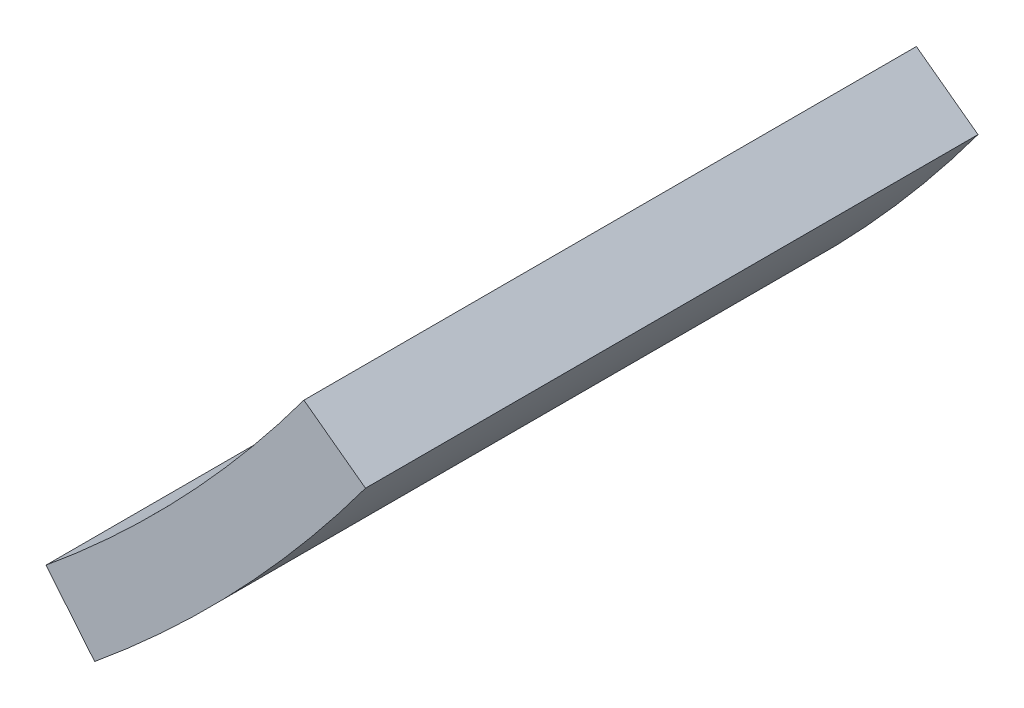
ISO-10303-21;
HEADER;
FILE_DESCRIPTION(('STEP AP214'),'2;1');
FILE_NAME('part.step','',(''),(''),'','','');
FILE_SCHEMA(('AUTOMOTIVE_DESIGN { 1 0 10303 214 1 1 1 1 }'));
ENDSEC;
DATA;
#1=APPLICATION_CONTEXT('core data for automotive mechanical design processes');
#2=APPLICATION_PROTOCOL_DEFINITION('international standard','automotive_design',2000,#1);
#3=PRODUCT_CONTEXT('',#1,'mechanical');
#4=PRODUCT('Part','Part','',(#3));
#5=PRODUCT_RELATED_PRODUCT_CATEGORY('part','',(#4));
#6=PRODUCT_DEFINITION_FORMATION('','',#4);
#7=PRODUCT_DEFINITION_CONTEXT('part definition',#1,'design');
#8=PRODUCT_DEFINITION('design','',#6,#7);
#9=PRODUCT_DEFINITION_SHAPE('','',#8);
#10=(LENGTH_UNIT() NAMED_UNIT(*) SI_UNIT(.MILLI.,.METRE.));
#11=(NAMED_UNIT(*) PLANE_ANGLE_UNIT() SI_UNIT($,.RADIAN.));
#12=(NAMED_UNIT(*) SI_UNIT($,.STERADIAN.) SOLID_ANGLE_UNIT());
#13=UNCERTAINTY_MEASURE_WITH_UNIT(LENGTH_MEASURE(1.E-05),#10,'distance_accuracy_value','');
#14=(GEOMETRIC_REPRESENTATION_CONTEXT(3) GLOBAL_UNCERTAINTY_ASSIGNED_CONTEXT((#13)) GLOBAL_UNIT_ASSIGNED_CONTEXT((#10,
#11,#12)) REPRESENTATION_CONTEXT('',''));
#15=CARTESIAN_POINT('',(0.,0.,0.));
#16=DIRECTION('',(0.,0.,1.));
#17=DIRECTION('',(1.,0.,0.));
#18=AXIS2_PLACEMENT_3D('',#15,#16,#17);
#19=CARTESIAN_POINT('',(-47.8023196423174,-23.0706537632891,10.));
#20=DIRECTION('',(0.772058239718347,0.63555178741233,0.));
#21=DIRECTION('',(0.,0.,-1.));
#22=AXIS2_PLACEMENT_3D('',#19,#20,#21);
#23=PLANE('',#22);
#24=DIRECTION('',(0.635551787412331,-0.772058239718347,0.));
#25=VECTOR('',#24,1.);
#26=CARTESIAN_POINT('',(-47.8023196423174,-23.0706537632891,-18.));
#27=LINE('',#26,#25);
#28=CARTESIAN_POINT('',(-18.0117501788919,-59.2597654543832,-18.));
#29=VERTEX_POINT('',#28);
#30=CARTESIAN_POINT('',(-15.3106550824186,-62.541012973151,-18.));
#31=VERTEX_POINT('',#30);
#32=EDGE_CURVE('E11',#29,#31,#27,.T.);
#33=ORIENTED_EDGE('',*,*,#32,.T.);
#34=DIRECTION('',(0.,0.,-1.));
#35=VECTOR('',#34,1.);
#36=CARTESIAN_POINT('',(-15.3106550824186,-62.541012973151,10.));
#37=LINE('',#36,#35);
#38=CARTESIAN_POINT('',(-15.3106550824186,-62.541012973151,16.));
#39=VERTEX_POINT('',#38);
#40=EDGE_CURVE('E37',#39,#31,#37,.T.);
#41=ORIENTED_EDGE('',*,*,#40,.F.);
#42=DIRECTION('',(0.635551787412331,-0.772058239718347,0.));
#43=VECTOR('',#42,1.);
#44=CARTESIAN_POINT('',(-47.8023196423174,-23.0706537632891,16.));
#45=LINE('',#44,#43);
#46=CARTESIAN_POINT('',(-18.0117501788919,-59.2597654543832,16.));
#47=VERTEX_POINT('',#46);
#48=EDGE_CURVE('E21',#47,#39,#45,.T.);
#49=ORIENTED_EDGE('',*,*,#48,.F.);
#50=DIRECTION('',(0.,0.,-1.));
#51=VECTOR('',#50,1.);
#52=CARTESIAN_POINT('',(-18.0117501788919,-59.2597654543832,10.));
#53=LINE('',#52,#51);
#54=EDGE_CURVE('E28',#47,#29,#53,.T.);
#55=ORIENTED_EDGE('',*,*,#54,.T.);
#56=EDGE_LOOP('',(#33,#41,#49,#55));
#57=FACE_BOUND('',#56,.T.);
#58=ADVANCED_FACE('F17',(#57),#23,.F.);
#59=CARTESIAN_POINT('',(-71.8747641621128,6.17217036174182,10.));
#60=DIRECTION('',(0.,0.,-1.));
#61=DIRECTION('',(-1.,0.,0.));
#62=AXIS2_PLACEMENT_3D('',#59,#60,#61);
#63=CYLINDRICAL_SURFACE('',#62,88.999999999967);
#64=CARTESIAN_POINT('',(-71.8747641621128,6.17217036174182,-18.));
#65=DIRECTION('',(0.,0.,1.));
#66=DIRECTION('',(-1.,0.,0.));
#67=AXIS2_PLACEMENT_3D('',#64,#65,#66);
#68=CIRCLE('',#67,88.999999999967);
#69=CARTESIAN_POINT('',(-0.277555078629754,-46.6940726620456,-18.));
#70=VERTEX_POINT('',#69);
#71=EDGE_CURVE('E89',#31,#70,#68,.T.);
#72=ORIENTED_EDGE('',*,*,#71,.T.);
#73=DIRECTION('',(0.,0.,-1.));
#74=VECTOR('',#73,1.);
#75=CARTESIAN_POINT('',(-0.277555078629754,-46.6940726620456,10.));
#76=LINE('',#75,#74);
#77=CARTESIAN_POINT('',(-0.277555078629754,-46.6940726620456,16.));
#78=VERTEX_POINT('',#77);
#79=EDGE_CURVE('E76',#78,#70,#76,.T.);
#80=ORIENTED_EDGE('',*,*,#79,.F.);
#81=CARTESIAN_POINT('',(-71.8747641621128,6.17217036174182,16.));
#82=DIRECTION('',(0.,0.,1.));
#83=DIRECTION('',(-1.,0.,0.));
#84=AXIS2_PLACEMENT_3D('',#81,#82,#83);
#85=CIRCLE('',#84,88.999999999967);
#86=EDGE_CURVE('E53',#39,#78,#85,.T.);
#87=ORIENTED_EDGE('',*,*,#86,.F.);
#88=ORIENTED_EDGE('',*,*,#40,.T.);
#89=EDGE_LOOP('',(#72,#80,#87,#88));
#90=FACE_BOUND('',#89,.T.);
#91=ADVANCED_FACE('F19',(#90),#63,.T.);
#92=CARTESIAN_POINT('',(-43.3454063504031,-14.8934547178341,10.));
#93=DIRECTION('',(-0.59400273061973,-0.804463023399028,0.));
#94=DIRECTION('',(-0.804463023399028,0.59400273061973,0.));
#95=AXIS2_PLACEMENT_3D('',#92,#93,#94);
#96=PLANE('',#95);
#97=DIRECTION('',(-0.804463023399028,0.59400273061973,0.));
#98=VECTOR('',#97,1.);
#99=CARTESIAN_POINT('',(-43.3454063504031,-14.8934547178341,-18.));
#100=LINE('',#99,#98);
#101=CARTESIAN_POINT('',(-3.69652292803895,-44.1695610569388,-18.));
#102=VERTEX_POINT('',#101);
#103=EDGE_CURVE('E74',#70,#102,#100,.T.);
#104=ORIENTED_EDGE('',*,*,#103,.T.);
#105=DIRECTION('',(0.,0.,-1.));
#106=VECTOR('',#105,1.);
#107=CARTESIAN_POINT('',(-3.69652292803895,-44.1695610569388,10.));
#108=LINE('',#107,#106);
#109=CARTESIAN_POINT('',(-3.69652292803895,-44.1695610569388,16.));
#110=VERTEX_POINT('',#109);
#111=EDGE_CURVE('E61',#110,#102,#108,.T.);
#112=ORIENTED_EDGE('',*,*,#111,.F.);
#113=DIRECTION('',(-0.804463023399028,0.59400273061973,0.));
#114=VECTOR('',#113,1.);
#115=CARTESIAN_POINT('',(-43.3454063504031,-14.8934547178341,16.));
#116=LINE('',#115,#114);
#117=EDGE_CURVE('E94',#78,#110,#116,.T.);
#118=ORIENTED_EDGE('',*,*,#117,.F.);
#119=ORIENTED_EDGE('',*,*,#79,.T.);
#120=EDGE_LOOP('',(#104,#112,#118,#119));
#121=FACE_BOUND('',#120,.T.);
#122=ADVANCED_FACE('F75',(#121),#96,.F.);
#123=CARTESIAN_POINT('',(-71.8747641621128,6.17217036174182,10.));
#124=DIRECTION('',(0.,0.,-1.));
#125=DIRECTION('',(-1.,0.,0.));
#126=AXIS2_PLACEMENT_3D('',#123,#124,#125);
#127=CYLINDRICAL_SURFACE('',#126,84.7500000000126);
#128=CARTESIAN_POINT('',(-71.8747641621128,6.17217036174182,-18.));
#129=DIRECTION('',(0.,0.,1.));
#130=DIRECTION('',(-1.,0.,0.));
#131=AXIS2_PLACEMENT_3D('',#128,#129,#130);
#132=CIRCLE('',#131,84.7500000000126);
#133=EDGE_CURVE('E66',#29,#102,#132,.T.);
#134=ORIENTED_EDGE('',*,*,#133,.F.);
#135=ORIENTED_EDGE('',*,*,#54,.F.);
#136=CARTESIAN_POINT('',(-71.8747641621128,6.17217036174182,16.));
#137=DIRECTION('',(0.,0.,1.));
#138=DIRECTION('',(-1.,0.,0.));
#139=AXIS2_PLACEMENT_3D('',#136,#137,#138);
#140=CIRCLE('',#139,84.7500000000126);
#141=EDGE_CURVE('E68',#47,#110,#140,.T.);
#142=ORIENTED_EDGE('',*,*,#141,.T.);
#143=ORIENTED_EDGE('',*,*,#111,.T.);
#144=EDGE_LOOP('',(#134,#135,#142,#143));
#145=FACE_BOUND('',#144,.T.);
#146=ADVANCED_FACE('F63',(#145),#127,.F.);
#147=CARTESIAN_POINT('',(-51.833752333337,-26.38929492376,-18.));
#148=DIRECTION('',(0.,0.,1.));
#149=DIRECTION('',(1.,0.,0.));
#150=AXIS2_PLACEMENT_3D('',#147,#148,#149);
#151=PLANE('',#150);
#152=ORIENTED_EDGE('',*,*,#133,.T.);
#153=ORIENTED_EDGE('',*,*,#103,.F.);
#154=ORIENTED_EDGE('',*,*,#71,.F.);
#155=ORIENTED_EDGE('',*,*,#32,.F.);
#156=EDGE_LOOP('',(#152,#153,#154,#155));
#157=FACE_BOUND('',#156,.T.);
#158=ADVANCED_FACE('F82',(#157),#151,.F.);
#159=CARTESIAN_POINT('',(-51.833752333337,-26.38929492376,16.));
#160=DIRECTION('',(0.,0.,1.));
#161=DIRECTION('',(1.,0.,0.));
#162=AXIS2_PLACEMENT_3D('',#159,#160,#161);
#163=PLANE('',#162);
#164=ORIENTED_EDGE('',*,*,#141,.F.);
#165=ORIENTED_EDGE('',*,*,#48,.T.);
#166=ORIENTED_EDGE('',*,*,#86,.T.);
#167=ORIENTED_EDGE('',*,*,#117,.T.);
#168=EDGE_LOOP('',(#164,#165,#166,#167));
#169=FACE_BOUND('',#168,.T.);
#170=ADVANCED_FACE('F150',(#169),#163,.T.);
#171=CLOSED_SHELL('',(#58,#91,#122,#146,#158,#170));
#172=MANIFOLD_SOLID_BREP('B1',#171);
#173=ADVANCED_BREP_SHAPE_REPRESENTATION('',(#18,#172),#14);
#174=SHAPE_DEFINITION_REPRESENTATION(#9,#173);
ENDSEC;
END-ISO-10303-21;
